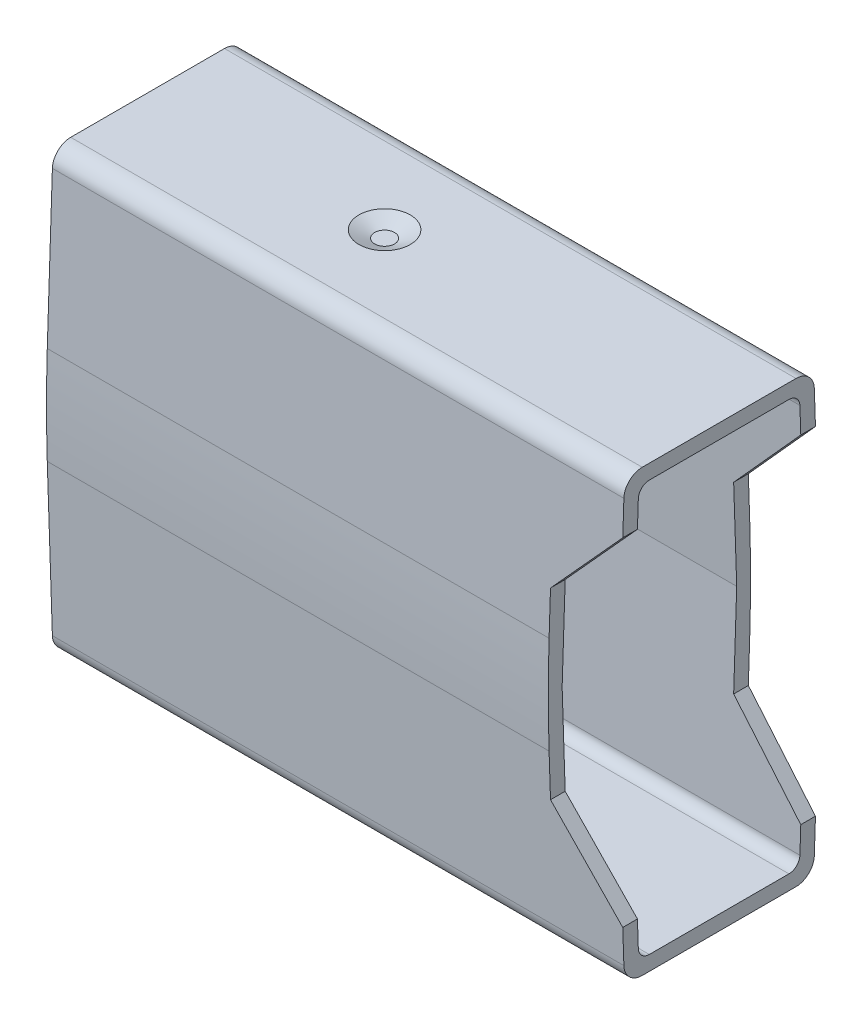
ISO-10303-21;
HEADER;
FILE_DESCRIPTION(('STEP AP214'),'2;1');
FILE_NAME('part.step','',(''),(''),'','','');
FILE_SCHEMA(('AUTOMOTIVE_DESIGN { 1 0 10303 214 1 1 1 1 }'));
ENDSEC;
DATA;
#1=APPLICATION_CONTEXT('core data for automotive mechanical design processes');
#2=APPLICATION_PROTOCOL_DEFINITION('international standard','automotive_design',2000,#1);
#3=PRODUCT_CONTEXT('',#1,'mechanical');
#4=PRODUCT('Part','Part','',(#3));
#5=PRODUCT_RELATED_PRODUCT_CATEGORY('part','',(#4));
#6=PRODUCT_DEFINITION_FORMATION('','',#4);
#7=PRODUCT_DEFINITION_CONTEXT('part definition',#1,'design');
#8=PRODUCT_DEFINITION('design','',#6,#7);
#9=PRODUCT_DEFINITION_SHAPE('','',#8);
#10=(LENGTH_UNIT() NAMED_UNIT(*) SI_UNIT(.MILLI.,.METRE.));
#11=(NAMED_UNIT(*) PLANE_ANGLE_UNIT() SI_UNIT($,.RADIAN.));
#12=(NAMED_UNIT(*) SI_UNIT($,.STERADIAN.) SOLID_ANGLE_UNIT());
#13=UNCERTAINTY_MEASURE_WITH_UNIT(LENGTH_MEASURE(1.E-05),#10,'distance_accuracy_value','');
#14=(GEOMETRIC_REPRESENTATION_CONTEXT(3) GLOBAL_UNCERTAINTY_ASSIGNED_CONTEXT((#13)) GLOBAL_UNIT_ASSIGNED_CONTEXT((#10,
#11,#12)) REPRESENTATION_CONTEXT('',''));
#15=CARTESIAN_POINT('',(0.,0.,0.));
#16=DIRECTION('',(0.,0.,1.));
#17=DIRECTION('',(1.,0.,0.));
#18=AXIS2_PLACEMENT_3D('',#15,#16,#17);
#19=CARTESIAN_POINT('',(80.645,6.985,-6.19303264711368));
#20=DIRECTION('',(1.,0.,0.));
#21=DIRECTION('',(0.,0.,-1.));
#22=AXIS2_PLACEMENT_3D('',#19,#20,#21);
#23=PLANE('',#22);
#24=DIRECTION('',(0.,0.,1.));
#25=VECTOR('',#24,1.);
#26=CARTESIAN_POINT('',(80.645,5.842,-7.03299012029518));
#27=LINE('',#26,#25);
#28=CARTESIAN_POINT('',(80.645,5.842,-6.86648222632835));
#29=VERTEX_POINT('',#28);
#30=CARTESIAN_POINT('',(80.645,5.842,-6.3582001275313));
#31=VERTEX_POINT('',#30);
#32=EDGE_CURVE('E441',#29,#31,#27,.T.);
#33=ORIENTED_EDGE('',*,*,#32,.F.);
#34=DIRECTION('',(0.,0.999444995608313,0.0333121712516466));
#35=VECTOR('',#34,1.);
#36=CARTESIAN_POINT('',(80.645,7.0061532287448,-6.82768021932496));
#37=LINE('',#36,#35);
#38=CARTESIAN_POINT('',(80.645,7.0061532287448,-6.82768021932496));
#39=VERTEX_POINT('',#38);
#40=EDGE_CURVE('E338',#29,#39,#37,.T.);
#41=ORIENTED_EDGE('',*,*,#40,.T.);
#42=CARTESIAN_POINT('',(80.645,6.985,-6.19303264711368));
#43=DIRECTION('',(1.,0.,0.));
#44=DIRECTION('',(0.,0.,-1.));
#45=AXIS2_PLACEMENT_3D('',#42,#43,#44);
#46=CIRCLE('',#45,0.635);
#47=CARTESIAN_POINT('',(80.645,7.62,-6.19303264711368));
#48=VERTEX_POINT('',#47);
#49=EDGE_CURVE('E377',#39,#48,#46,.T.);
#50=ORIENTED_EDGE('',*,*,#49,.T.);
#51=DIRECTION('',(0.,0.,1.));
#52=VECTOR('',#51,1.);
#53=CARTESIAN_POINT('',(80.645,7.62,-6.19303264711368));
#54=LINE('',#53,#52);
#55=CARTESIAN_POINT('',(80.645,7.62,-0.868167352886323));
#56=VERTEX_POINT('',#55);
#57=EDGE_CURVE('E376',#48,#56,#54,.T.);
#58=ORIENTED_EDGE('',*,*,#57,.T.);
#59=CARTESIAN_POINT('',(80.645,6.985,-0.868167352886323));
#60=DIRECTION('',(1.,0.,0.));
#61=DIRECTION('',(0.,0.,-1.));
#62=AXIS2_PLACEMENT_3D('',#59,#60,#61);
#63=CIRCLE('',#62,0.635);
#64=CARTESIAN_POINT('',(80.645,7.0061532287448,-0.233519780675044));
#65=VERTEX_POINT('',#64);
#66=EDGE_CURVE('E327',#56,#65,#63,.T.);
#67=ORIENTED_EDGE('',*,*,#66,.T.);
#68=DIRECTION('',(0.,-0.999444995608313,0.0333121712516467));
#69=VECTOR('',#68,1.);
#70=CARTESIAN_POINT('',(80.645,7.0061532287448,-0.233519780675044));
#71=LINE('',#70,#69);
#72=CARTESIAN_POINT('',(80.645,5.842,-0.194717773671647));
#73=VERTEX_POINT('',#72);
#74=EDGE_CURVE('E323',#65,#73,#71,.T.);
#75=ORIENTED_EDGE('',*,*,#74,.T.);
#76=CARTESIAN_POINT('',(80.645,5.842,-0.702999872468696));
#77=VERTEX_POINT('',#76);
#78=EDGE_CURVE('E448',#77,#73,#27,.T.);
#79=ORIENTED_EDGE('',*,*,#78,.F.);
#80=DIRECTION('',(0.,-0.999444995608313,0.0333121712516467));
#81=VECTOR('',#80,1.);
#82=CARTESIAN_POINT('',(80.645,0.,-0.508282098797048));
#83=LINE('',#82,#81);
#84=CARTESIAN_POINT('',(80.645,6.74369193724688,-0.733053868798443));
#85=VERTEX_POINT('',#84);
#86=EDGE_CURVE('E396',#85,#77,#83,.T.);
#87=ORIENTED_EDGE('',*,*,#86,.F.);
#88=CARTESIAN_POINT('',(80.645,6.731,-1.11384241212521));
#89=DIRECTION('',(1.,0.,0.));
#90=DIRECTION('',(0.,0.,-1.));
#91=AXIS2_PLACEMENT_3D('',#88,#89,#90);
#92=CIRCLE('',#91,0.381);
#93=CARTESIAN_POINT('',(80.645,7.112,-1.11384241212521));
#94=VERTEX_POINT('',#93);
#95=EDGE_CURVE('E399',#94,#85,#92,.T.);
#96=ORIENTED_EDGE('',*,*,#95,.F.);
#97=DIRECTION('',(0.,0.,1.));
#98=VECTOR('',#97,1.);
#99=CARTESIAN_POINT('',(80.645,7.112,-1.11384241212521));
#100=LINE('',#99,#98);
#101=CARTESIAN_POINT('',(80.645,7.112,-5.94735758787479));
#102=VERTEX_POINT('',#101);
#103=EDGE_CURVE('E402',#102,#94,#100,.T.);
#104=ORIENTED_EDGE('',*,*,#103,.F.);
#105=CARTESIAN_POINT('',(80.645,6.731,-5.94735758787479));
#106=DIRECTION('',(1.,0.,0.));
#107=DIRECTION('',(0.,0.,-1.));
#108=AXIS2_PLACEMENT_3D('',#105,#106,#107);
#109=CIRCLE('',#108,0.381);
#110=CARTESIAN_POINT('',(80.645,6.74369193724688,-6.32814613120156));
#111=VERTEX_POINT('',#110);
#112=EDGE_CURVE('E405',#111,#102,#109,.T.);
#113=ORIENTED_EDGE('',*,*,#112,.F.);
#114=DIRECTION('',(0.,0.999444995608313,0.0333121712516466));
#115=VECTOR('',#114,1.);
#116=CARTESIAN_POINT('',(80.645,6.74369193724688,-6.32814613120156));
#117=LINE('',#116,#115);
#118=EDGE_CURVE('E381',#31,#111,#117,.T.);
#119=ORIENTED_EDGE('',*,*,#118,.F.);
#120=EDGE_LOOP('',(#33,#41,#50,#58,#67,#75,#79,#87,#96,#104,#113,#119));
#121=FACE_BOUND('',#120,.T.);
#122=ADVANCED_FACE('F37',(#121),#23,.T.);
#123=CARTESIAN_POINT('',(80.645,0.,-6.55291790120295));
#124=DIRECTION('',(0.,-0.0333121712516467,0.999444995608313));
#125=DIRECTION('',(0.,-0.999444995608313,-0.0333121712516467));
#126=AXIS2_PLACEMENT_3D('',#123,#124,#125);
#127=PLANE('',#126);
#128=DIRECTION('',(0.,0.999444995608313,0.0333121712516467));
#129=VECTOR('',#128,1.);
#130=CARTESIAN_POINT('',(60.8571217387208,0.,-6.55291790120295));
#131=LINE('',#130,#129);
#132=CARTESIAN_POINT('',(60.8571217387208,0.,-6.55291790120295));
#133=VERTEX_POINT('',#132);
#134=CARTESIAN_POINT('',(60.8571217387208,6.74369193724688,-6.32814613120156));
#135=VERTEX_POINT('',#134);
#136=EDGE_CURVE('E469',#133,#135,#131,.T.);
#137=ORIENTED_EDGE('',*,*,#136,.F.);
#138=DIRECTION('',(-1.,0.,0.));
#139=VECTOR('',#138,1.);
#140=CARTESIAN_POINT('',(80.645,0.,-6.55291790120295));
#141=LINE('',#140,#139);
#142=CARTESIAN_POINT('',(78.232,0.,-6.55291790120295));
#143=VERTEX_POINT('',#142);
#144=EDGE_CURVE('E344',#143,#133,#141,.T.);
#145=ORIENTED_EDGE('',*,*,#144,.F.);
#146=DIRECTION('',(0.,-0.999444995608313,-0.0333121712516467));
#147=VECTOR('',#146,1.);
#148=CARTESIAN_POINT('',(78.232,0.,-6.55291790120295));
#149=LINE('',#148,#147);
#150=CARTESIAN_POINT('',(78.232,3.175,-6.44709302420749));
#151=VERTEX_POINT('',#150);
#152=EDGE_CURVE('E420',#151,#143,#149,.T.);
#153=ORIENTED_EDGE('',*,*,#152,.F.);
#154=DIRECTION('',(-0.670708495740711,-0.741309390029208,-0.0247083385875341));
#155=VECTOR('',#154,1.);
#156=CARTESIAN_POINT('',(77.7371160797596,2.62802303552372,-6.4653241328642));
#157=LINE('',#156,#155);
#158=EDGE_CURVE('E414',#31,#151,#157,.T.);
#159=ORIENTED_EDGE('',*,*,#158,.F.);
#160=ORIENTED_EDGE('',*,*,#118,.T.);
#161=DIRECTION('',(-1.,0.,0.));
#162=VECTOR('',#161,1.);
#163=CARTESIAN_POINT('',(0.237047724469863,6.74369193724688,-6.32814613120156));
#164=LINE('',#163,#162);
#165=EDGE_CURVE('E261',#111,#135,#164,.T.);
#166=ORIENTED_EDGE('',*,*,#165,.T.);
#167=EDGE_LOOP('',(#137,#145,#153,#159,#160,#166));
#168=FACE_BOUND('',#167,.T.);
#169=ADVANCED_FACE('F518',(#168),#127,.T.);
#170=CARTESIAN_POINT('',(80.645,7.112,-0.74532982326688));
#171=DIRECTION('',(0.,-0.0333121712516467,-0.999444995608313));
#172=DIRECTION('',(0.,0.999444995608313,-0.0333121712516467));
#173=AXIS2_PLACEMENT_3D('',#170,#171,#172);
#174=PLANE('',#173);
#175=DIRECTION('',(0.,-0.999444995608313,0.0333121712516467));
#176=VECTOR('',#175,1.);
#177=CARTESIAN_POINT('',(60.8571217387208,7.112,-0.74532982326688));
#178=LINE('',#177,#176);
#179=CARTESIAN_POINT('',(60.8571217387208,6.74369193724688,-0.733053868798443));
#180=VERTEX_POINT('',#179);
#181=CARTESIAN_POINT('',(60.8571217387208,0.,-0.508282098797048));
#182=VERTEX_POINT('',#181);
#183=EDGE_CURVE('E52',#180,#182,#178,.T.);
#184=ORIENTED_EDGE('',*,*,#183,.F.);
#185=DIRECTION('',(-1.,0.,0.));
#186=VECTOR('',#185,1.);
#187=CARTESIAN_POINT('',(80.4079522755302,6.74369193724688,-0.733053868798443));
#188=LINE('',#187,#186);
#189=EDGE_CURVE('E273',#180,#85,#188,.F.);
#190=ORIENTED_EDGE('',*,*,#189,.T.);
#191=ORIENTED_EDGE('',*,*,#86,.T.);
#192=DIRECTION('',(0.670708495740711,0.741309390029208,-0.0247083385875341));
#193=VECTOR('',#192,1.);
#194=CARTESIAN_POINT('',(81.2771486783131,6.54069064445136,-0.726287699714977));
#195=LINE('',#194,#193);
#196=CARTESIAN_POINT('',(78.232,3.175,-0.614106975792508));
#197=VERTEX_POINT('',#196);
#198=EDGE_CURVE('E416',#197,#77,#195,.T.);
#199=ORIENTED_EDGE('',*,*,#198,.F.);
#200=DIRECTION('',(0.,0.999444995608313,-0.0333121712516467));
#201=VECTOR('',#200,1.);
#202=CARTESIAN_POINT('',(78.232,7.112,-0.74532982326688));
#203=LINE('',#202,#201);
#204=CARTESIAN_POINT('',(78.232,0.,-0.508282098797048));
#205=VERTEX_POINT('',#204);
#206=EDGE_CURVE('E424',#205,#197,#203,.T.);
#207=ORIENTED_EDGE('',*,*,#206,.F.);
#208=DIRECTION('',(-1.,0.,0.));
#209=VECTOR('',#208,1.);
#210=CARTESIAN_POINT('',(80.645,0.,-0.508282098797048));
#211=LINE('',#210,#209);
#212=EDGE_CURVE('E341',#205,#182,#211,.T.);
#213=ORIENTED_EDGE('',*,*,#212,.T.);
#214=EDGE_LOOP('',(#184,#190,#191,#199,#207,#213));
#215=FACE_BOUND('',#214,.T.);
#216=ADVANCED_FACE('F556',(#215),#174,.T.);
#217=CARTESIAN_POINT('',(80.645,6.731,-1.11384241212521));
#218=DIRECTION('',(1.,0.,0.));
#219=DIRECTION('',(0.,0.,-1.));
#220=AXIS2_PLACEMENT_3D('',#217,#218,#219);
#221=CYLINDRICAL_SURFACE('',#220,0.381);
#222=ORIENTED_EDGE('',*,*,#189,.F.);
#223=CARTESIAN_POINT('',(60.8571217387208,6.731,-1.11384241212521));
#224=DIRECTION('',(1.,0.,0.));
#225=DIRECTION('',(0.,0.,-1.));
#226=AXIS2_PLACEMENT_3D('',#223,#224,#225);
#227=CIRCLE('',#226,0.381);
#228=CARTESIAN_POINT('',(60.8571217387208,7.112,-1.11384241212521));
#229=VERTEX_POINT('',#228);
#230=EDGE_CURVE('E461',#180,#229,#227,.F.);
#231=ORIENTED_EDGE('',*,*,#230,.T.);
#232=DIRECTION('',(-1.,0.,0.));
#233=VECTOR('',#232,1.);
#234=CARTESIAN_POINT('',(0.237047724469849,7.112,-1.11384241212521));
#235=LINE('',#234,#233);
#236=EDGE_CURVE('E268',#94,#229,#235,.T.);
#237=ORIENTED_EDGE('',*,*,#236,.F.);
#238=ORIENTED_EDGE('',*,*,#95,.T.);
#239=EDGE_LOOP('',(#222,#231,#237,#238));
#240=FACE_BOUND('',#239,.T.);
#241=ADVANCED_FACE('F579',(#240),#221,.F.);
#242=CARTESIAN_POINT('',(80.645,7.112,-6.31587017673312));
#243=DIRECTION('',(0.,-1.,0.));
#244=DIRECTION('',(0.,0.,-1.));
#245=AXIS2_PLACEMENT_3D('',#242,#243,#244);
#246=PLANE('',#245);
#247=DIRECTION('',(0.,0.,1.));
#248=VECTOR('',#247,1.);
#249=CARTESIAN_POINT('',(60.8571217387208,7.112,-6.31587017673312));
#250=LINE('',#249,#248);
#251=CARTESIAN_POINT('',(60.8571217387208,7.112,-5.94735758787479));
#252=VERTEX_POINT('',#251);
#253=EDGE_CURVE('E464',#252,#229,#250,.T.);
#254=ORIENTED_EDGE('',*,*,#253,.F.);
#255=DIRECTION('',(-1.,0.,0.));
#256=VECTOR('',#255,1.);
#257=CARTESIAN_POINT('',(80.4079522755302,7.112,-5.94735758787479));
#258=LINE('',#257,#256);
#259=EDGE_CURVE('E271',#252,#102,#258,.F.);
#260=ORIENTED_EDGE('',*,*,#259,.T.);
#261=ORIENTED_EDGE('',*,*,#103,.T.);
#262=ORIENTED_EDGE('',*,*,#236,.T.);
#263=EDGE_LOOP('',(#254,#260,#261,#262));
#264=FACE_BOUND('',#263,.T.);
#265=ADVANCED_FACE('F581',(#264),#246,.T.);
#266=CARTESIAN_POINT('',(80.645,6.731,-5.94735758787479));
#267=DIRECTION('',(1.,0.,0.));
#268=DIRECTION('',(0.,0.,-1.));
#269=AXIS2_PLACEMENT_3D('',#266,#267,#268);
#270=CYLINDRICAL_SURFACE('',#269,0.381);
#271=ORIENTED_EDGE('',*,*,#259,.F.);
#272=CARTESIAN_POINT('',(60.8571217387208,6.731,-5.94735758787479));
#273=DIRECTION('',(1.,0.,0.));
#274=DIRECTION('',(0.,0.,-1.));
#275=AXIS2_PLACEMENT_3D('',#272,#273,#274);
#276=CIRCLE('',#275,0.381);
#277=EDGE_CURVE('E466',#252,#135,#276,.F.);
#278=ORIENTED_EDGE('',*,*,#277,.T.);
#279=ORIENTED_EDGE('',*,*,#165,.F.);
#280=ORIENTED_EDGE('',*,*,#112,.T.);
#281=EDGE_LOOP('',(#271,#278,#279,#280));
#282=FACE_BOUND('',#281,.T.);
#283=ADVANCED_FACE('F583',(#282),#270,.F.);
#284=CARTESIAN_POINT('',(80.645,-7.112,-6.31587017673312));
#285=DIRECTION('',(0.,0.0333121712516467,0.999444995608313));
#286=DIRECTION('',(0.,-0.999444995608313,0.0333121712516467));
#287=AXIS2_PLACEMENT_3D('',#284,#285,#286);
#288=PLANE('',#287);
#289=DIRECTION('',(0.,0.999444995608313,-0.0333121712516467));
#290=VECTOR('',#289,1.);
#291=CARTESIAN_POINT('',(60.8571217387208,-7.112,-6.31587017673312));
#292=LINE('',#291,#290);
#293=CARTESIAN_POINT('',(60.8571217387208,-6.74369193724688,-6.32814613120156));
#294=VERTEX_POINT('',#293);
#295=EDGE_CURVE('E472',#294,#133,#292,.T.);
#296=ORIENTED_EDGE('',*,*,#295,.F.);
#297=DIRECTION('',(-1.,0.,0.));
#298=VECTOR('',#297,1.);
#299=CARTESIAN_POINT('',(80.4079522755302,-6.74369193724688,-6.32814613120156));
#300=LINE('',#299,#298);
#301=CARTESIAN_POINT('',(80.645,-6.74369193724688,-6.32814613120156));
#302=VERTEX_POINT('',#301);
#303=EDGE_CURVE('E283',#294,#302,#300,.F.);
#304=ORIENTED_EDGE('',*,*,#303,.T.);
#305=DIRECTION('',(0.,0.999444995608313,-0.0333121712516466));
#306=VECTOR('',#305,1.);
#307=CARTESIAN_POINT('',(80.645,-6.74369193724688,-6.32814613120156));
#308=LINE('',#307,#306);
#309=CARTESIAN_POINT('',(80.645,-5.842,-6.3582001275313));
#310=VERTEX_POINT('',#309);
#311=EDGE_CURVE('E383',#302,#310,#308,.T.);
#312=ORIENTED_EDGE('',*,*,#311,.T.);
#313=DIRECTION('',(0.670708495740711,-0.741309390029207,0.0247083385875341));
#314=VECTOR('',#313,1.);
#315=CARTESIAN_POINT('',(81.2771486783131,-6.54069064445136,-6.33491230028502));
#316=LINE('',#315,#314);
#317=CARTESIAN_POINT('',(78.232,-3.175,-6.44709302420749));
#318=VERTEX_POINT('',#317);
#319=EDGE_CURVE('E408',#318,#310,#316,.T.);
#320=ORIENTED_EDGE('',*,*,#319,.F.);
#321=DIRECTION('',(0.,-0.999444995608313,0.0333121712516467));
#322=VECTOR('',#321,1.);
#323=CARTESIAN_POINT('',(78.232,-7.112,-6.31587017673312));
#324=LINE('',#323,#322);
#325=EDGE_CURVE('E422',#143,#318,#324,.T.);
#326=ORIENTED_EDGE('',*,*,#325,.F.);
#327=ORIENTED_EDGE('',*,*,#144,.T.);
#328=EDGE_LOOP('',(#296,#304,#312,#320,#326,#327));
#329=FACE_BOUND('',#328,.T.);
#330=ADVANCED_FACE('F521',(#329),#288,.T.);
#331=CARTESIAN_POINT('',(80.645,-6.731,-5.94735758787479));
#332=DIRECTION('',(1.,0.,0.));
#333=DIRECTION('',(0.,0.,-1.));
#334=AXIS2_PLACEMENT_3D('',#331,#332,#333);
#335=CYLINDRICAL_SURFACE('',#334,0.381);
#336=ORIENTED_EDGE('',*,*,#303,.F.);
#337=CARTESIAN_POINT('',(60.8571217387208,-6.731,-5.94735758787479));
#338=DIRECTION('',(1.,0.,0.));
#339=DIRECTION('',(0.,0.,-1.));
#340=AXIS2_PLACEMENT_3D('',#337,#338,#339);
#341=CIRCLE('',#340,0.381);
#342=CARTESIAN_POINT('',(60.8571217387208,-7.112,-5.94735758787479));
#343=VERTEX_POINT('',#342);
#344=EDGE_CURVE('E474',#294,#343,#341,.F.);
#345=ORIENTED_EDGE('',*,*,#344,.T.);
#346=DIRECTION('',(-1.,0.,0.));
#347=VECTOR('',#346,1.);
#348=CARTESIAN_POINT('',(0.237047724469863,-7.112,-5.94735758787479));
#349=LINE('',#348,#347);
#350=CARTESIAN_POINT('',(80.645,-7.112,-5.94735758787479));
#351=VERTEX_POINT('',#350);
#352=EDGE_CURVE('E278',#351,#343,#349,.T.);
#353=ORIENTED_EDGE('',*,*,#352,.F.);
#354=CARTESIAN_POINT('',(80.645,-6.731,-5.94735758787479));
#355=DIRECTION('',(1.,0.,0.));
#356=DIRECTION('',(0.,0.,-1.));
#357=AXIS2_PLACEMENT_3D('',#354,#355,#356);
#358=CIRCLE('',#357,0.381000000000001);
#359=EDGE_CURVE('E386',#351,#302,#358,.T.);
#360=ORIENTED_EDGE('',*,*,#359,.T.);
#361=EDGE_LOOP('',(#336,#345,#353,#360));
#362=FACE_BOUND('',#361,.T.);
#363=ADVANCED_FACE('F588',(#362),#335,.F.);
#364=CARTESIAN_POINT('',(80.645,-7.112,-0.74532982326688));
#365=DIRECTION('',(0.,1.,0.));
#366=DIRECTION('',(0.,0.,1.));
#367=AXIS2_PLACEMENT_3D('',#364,#365,#366);
#368=PLANE('',#367);
#369=DIRECTION('',(0.,0.,-1.));
#370=VECTOR('',#369,1.);
#371=CARTESIAN_POINT('',(60.8571217387208,-7.112,-0.74532982326688));
#372=LINE('',#371,#370);
#373=CARTESIAN_POINT('',(60.8571217387208,-7.112,-1.11384241212521));
#374=VERTEX_POINT('',#373);
#375=EDGE_CURVE('E477',#374,#343,#372,.T.);
#376=ORIENTED_EDGE('',*,*,#375,.F.);
#377=DIRECTION('',(-1.,0.,0.));
#378=VECTOR('',#377,1.);
#379=CARTESIAN_POINT('',(80.4079522755302,-7.112,-1.11384241212521));
#380=LINE('',#379,#378);
#381=CARTESIAN_POINT('',(80.645,-7.112,-1.11384241212521));
#382=VERTEX_POINT('',#381);
#383=EDGE_CURVE('E281',#374,#382,#380,.F.);
#384=ORIENTED_EDGE('',*,*,#383,.T.);
#385=DIRECTION('',(0.,0.,-1.));
#386=VECTOR('',#385,1.);
#387=CARTESIAN_POINT('',(80.645,-7.112,-1.11384241212521));
#388=LINE('',#387,#386);
#389=EDGE_CURVE('E389',#382,#351,#388,.T.);
#390=ORIENTED_EDGE('',*,*,#389,.T.);
#391=ORIENTED_EDGE('',*,*,#352,.T.);
#392=EDGE_LOOP('',(#376,#384,#390,#391));
#393=FACE_BOUND('',#392,.T.);
#394=ADVANCED_FACE('F573',(#393),#368,.T.);
#395=CARTESIAN_POINT('',(80.645,-6.731,-1.11384241212521));
#396=DIRECTION('',(1.,0.,0.));
#397=DIRECTION('',(0.,0.,-1.));
#398=AXIS2_PLACEMENT_3D('',#395,#396,#397);
#399=CYLINDRICAL_SURFACE('',#398,0.381);
#400=ORIENTED_EDGE('',*,*,#383,.F.);
#401=CARTESIAN_POINT('',(60.8571217387208,-6.731,-1.11384241212521));
#402=DIRECTION('',(1.,0.,0.));
#403=DIRECTION('',(0.,0.,-1.));
#404=AXIS2_PLACEMENT_3D('',#401,#402,#403);
#405=CIRCLE('',#404,0.381);
#406=CARTESIAN_POINT('',(60.8571217387208,-6.74369193724687,-0.733053868798443));
#407=VERTEX_POINT('',#406);
#408=EDGE_CURVE('E479',#374,#407,#405,.F.);
#409=ORIENTED_EDGE('',*,*,#408,.T.);
#410=DIRECTION('',(-1.,0.,0.));
#411=VECTOR('',#410,1.);
#412=CARTESIAN_POINT('',(0.237047724469863,-6.74369193724688,-0.733053868798443));
#413=LINE('',#412,#411);
#414=CARTESIAN_POINT('',(80.645,-6.74369193724688,-0.733053868798443));
#415=VERTEX_POINT('',#414);
#416=EDGE_CURVE('E275',#415,#407,#413,.T.);
#417=ORIENTED_EDGE('',*,*,#416,.F.);
#418=CARTESIAN_POINT('',(80.645,-6.731,-1.11384241212521));
#419=DIRECTION('',(1.,0.,0.));
#420=DIRECTION('',(0.,0.,-1.));
#421=AXIS2_PLACEMENT_3D('',#418,#419,#420);
#422=CIRCLE('',#421,0.381);
#423=EDGE_CURVE('E392',#415,#382,#422,.T.);
#424=ORIENTED_EDGE('',*,*,#423,.T.);
#425=EDGE_LOOP('',(#400,#409,#417,#424));
#426=FACE_BOUND('',#425,.T.);
#427=ADVANCED_FACE('F567',(#426),#399,.F.);
#428=CARTESIAN_POINT('',(80.645,0.,-0.508282098797048));
#429=DIRECTION('',(0.,0.0333121712516467,-0.999444995608313));
#430=DIRECTION('',(0.,0.999444995608313,0.0333121712516467));
#431=AXIS2_PLACEMENT_3D('',#428,#429,#430);
#432=PLANE('',#431);
#433=DIRECTION('',(0.,-0.999444995608313,-0.0333121712516467));
#434=VECTOR('',#433,1.);
#435=CARTESIAN_POINT('',(60.8571217387208,0.,-0.508282098797048));
#436=LINE('',#435,#434);
#437=EDGE_CURVE('E249',#182,#407,#436,.T.);
#438=ORIENTED_EDGE('',*,*,#437,.F.);
#439=ORIENTED_EDGE('',*,*,#212,.F.);
#440=DIRECTION('',(0.,0.999444995608313,0.0333121712516467));
#441=VECTOR('',#440,1.);
#442=CARTESIAN_POINT('',(78.232,0.,-0.508282098797048));
#443=LINE('',#442,#441);
#444=CARTESIAN_POINT('',(78.232,-3.175,-0.614106975792508));
#445=VERTEX_POINT('',#444);
#446=EDGE_CURVE('E426',#445,#205,#443,.T.);
#447=ORIENTED_EDGE('',*,*,#446,.F.);
#448=DIRECTION('',(-0.670708495740711,0.741309390029207,0.0247083385875341));
#449=VECTOR('',#448,1.);
#450=CARTESIAN_POINT('',(77.7371160797596,-2.62802303552372,-0.595875867135799));
#451=LINE('',#450,#449);
#452=CARTESIAN_POINT('',(80.645,-5.842,-0.702999872468696));
#453=VERTEX_POINT('',#452);
#454=EDGE_CURVE('E410',#453,#445,#451,.T.);
#455=ORIENTED_EDGE('',*,*,#454,.F.);
#456=DIRECTION('',(0.,-0.999444995608313,-0.0333121712516467));
#457=VECTOR('',#456,1.);
#458=CARTESIAN_POINT('',(80.645,0.,-0.508282098797048));
#459=LINE('',#458,#457);
#460=EDGE_CURVE('E317',#453,#415,#459,.T.);
#461=ORIENTED_EDGE('',*,*,#460,.T.);
#462=ORIENTED_EDGE('',*,*,#416,.T.);
#463=EDGE_LOOP('',(#438,#439,#447,#455,#461,#462));
#464=FACE_BOUND('',#463,.T.);
#465=ADVANCED_FACE('F561',(#464),#432,.T.);
#466=DIRECTION('',(0.,0.,1.));
#467=VECTOR('',#466,1.);
#468=CARTESIAN_POINT('',(80.645,-5.842,-7.03299012029518));
#469=LINE('',#468,#467);
#470=CARTESIAN_POINT('',(80.645,-5.842,-0.194717773671648));
#471=VERTEX_POINT('',#470);
#472=EDGE_CURVE('E304',#453,#471,#469,.T.);
#473=ORIENTED_EDGE('',*,*,#472,.T.);
#474=DIRECTION('',(0.,-0.999444995608313,-0.0333121712516467));
#475=VECTOR('',#474,1.);
#476=CARTESIAN_POINT('',(80.645,-7.0061532287448,-0.233519780675044));
#477=LINE('',#476,#475);
#478=CARTESIAN_POINT('',(80.645,-7.0061532287448,-0.233519780675044));
#479=VERTEX_POINT('',#478);
#480=EDGE_CURVE('E315',#471,#479,#477,.T.);
#481=ORIENTED_EDGE('',*,*,#480,.T.);
#482=CARTESIAN_POINT('',(80.645,-6.985,-0.868167352886323));
#483=DIRECTION('',(1.,0.,0.));
#484=DIRECTION('',(0.,0.,-1.));
#485=AXIS2_PLACEMENT_3D('',#482,#483,#484);
#486=CIRCLE('',#485,0.635);
#487=CARTESIAN_POINT('',(80.645,-7.62,-0.868167352886323));
#488=VERTEX_POINT('',#487);
#489=EDGE_CURVE('E322',#479,#488,#486,.T.);
#490=ORIENTED_EDGE('',*,*,#489,.T.);
#491=DIRECTION('',(0.,0.,-1.));
#492=VECTOR('',#491,1.);
#493=CARTESIAN_POINT('',(80.645,-7.62,-6.19303264711368));
#494=LINE('',#493,#492);
#495=CARTESIAN_POINT('',(80.645,-7.62,-6.19303264711368));
#496=VERTEX_POINT('',#495);
#497=EDGE_CURVE('E256',#488,#496,#494,.T.);
#498=ORIENTED_EDGE('',*,*,#497,.T.);
#499=CARTESIAN_POINT('',(80.645,-6.985,-6.19303264711368));
#500=DIRECTION('',(1.,0.,0.));
#501=DIRECTION('',(0.,0.,-1.));
#502=AXIS2_PLACEMENT_3D('',#499,#500,#501);
#503=CIRCLE('',#502,0.635);
#504=CARTESIAN_POINT('',(80.645,-7.0061532287448,-6.82768021932496));
#505=VERTEX_POINT('',#504);
#506=EDGE_CURVE('E332',#496,#505,#503,.T.);
#507=ORIENTED_EDGE('',*,*,#506,.T.);
#508=DIRECTION('',(0.,0.999444995608313,-0.0333121712516466));
#509=VECTOR('',#508,1.);
#510=CARTESIAN_POINT('',(80.645,-7.0061532287448,-6.82768021932496));
#511=LINE('',#510,#509);
#512=CARTESIAN_POINT('',(80.645,-5.842,-6.86648222632835));
#513=VERTEX_POINT('',#512);
#514=EDGE_CURVE('E335',#505,#513,#511,.T.);
#515=ORIENTED_EDGE('',*,*,#514,.T.);
#516=EDGE_CURVE('E318',#513,#310,#469,.T.);
#517=ORIENTED_EDGE('',*,*,#516,.T.);
#518=ORIENTED_EDGE('',*,*,#311,.F.);
#519=ORIENTED_EDGE('',*,*,#359,.F.);
#520=ORIENTED_EDGE('',*,*,#389,.F.);
#521=ORIENTED_EDGE('',*,*,#423,.F.);
#522=ORIENTED_EDGE('',*,*,#460,.F.);
#523=EDGE_LOOP('',(#473,#481,#490,#498,#507,#515,#517,#518,#519,#520,#521,#522));
#524=FACE_BOUND('',#523,.T.);
#525=ADVANCED_FACE('F314',(#524),#23,.T.);
#526=CARTESIAN_POINT('',(0.,0.,-7.0612));
#527=DIRECTION('',(0.,-0.0333121712516467,-0.999444995608313));
#528=DIRECTION('',(0.,0.999444995608313,-0.0333121712516467));
#529=AXIS2_PLACEMENT_3D('',#526,#527,#528);
#530=PLANE('',#529);
#531=DIRECTION('',(0.,-0.999444995608313,0.0333121712516467));
#532=VECTOR('',#531,1.);
#533=CARTESIAN_POINT('',(60.8571217387208,0.,-7.0612));
#534=LINE('',#533,#532);
#535=CARTESIAN_POINT('',(60.8571217387208,-1.69225829958366,-7.00479589719749));
#536=VERTEX_POINT('',#535);
#537=CARTESIAN_POINT('',(60.8571217387208,-7.00615322874479,-6.82768021932496));
#538=VERTEX_POINT('',#537);
#539=EDGE_CURVE('E494',#536,#538,#534,.T.);
#540=ORIENTED_EDGE('',*,*,#539,.F.);
#541=DIRECTION('',(1.,0.,0.));
#542=VECTOR('',#541,1.);
#543=CARTESIAN_POINT('',(80.645,-1.69225829958365,-7.00479589719748));
#544=LINE('',#543,#542);
#545=CARTESIAN_POINT('',(78.232,-1.69225829958366,-7.0047958971975));
#546=VERTEX_POINT('',#545);
#547=EDGE_CURVE('E293',#536,#546,#544,.T.);
#548=ORIENTED_EDGE('',*,*,#547,.T.);
#549=DIRECTION('',(0.,0.999444995608313,-0.0333121712516467));
#550=VECTOR('',#549,1.);
#551=CARTESIAN_POINT('',(78.232,0.,-7.0612));
#552=LINE('',#551,#550);
#553=CARTESIAN_POINT('',(78.232,-3.175,-6.95537512300454));
#554=VERTEX_POINT('',#553);
#555=EDGE_CURVE('E435',#554,#546,#552,.T.);
#556=ORIENTED_EDGE('',*,*,#555,.F.);
#557=DIRECTION('',(-0.670708495740712,0.741309390029207,-0.0247083385875341));
#558=VECTOR('',#557,1.);
#559=CARTESIAN_POINT('',(41.4589720024212,37.4688730499555,-8.31006263989608));
#560=LINE('',#559,#558);
#561=EDGE_CURVE('E412',#513,#554,#560,.T.);
#562=ORIENTED_EDGE('',*,*,#561,.F.);
#563=ORIENTED_EDGE('',*,*,#514,.F.);
#564=DIRECTION('',(-1.,0.,0.));
#565=VECTOR('',#564,1.);
#566=CARTESIAN_POINT('',(0.,-7.00615322874479,-6.82768021932496));
#567=LINE('',#566,#565);
#568=EDGE_CURVE('E257',#505,#538,#567,.T.);
#569=ORIENTED_EDGE('',*,*,#568,.T.);
#570=EDGE_LOOP('',(#540,#548,#556,#562,#563,#569));
#571=FACE_BOUND('',#570,.T.);
#572=ADVANCED_FACE('F534',(#571),#530,.T.);
#573=CARTESIAN_POINT('',(0.,0.,0.));
#574=DIRECTION('',(0.,-0.0333121712516467,0.999444995608313));
#575=DIRECTION('',(0.,-0.999444995608313,-0.0333121712516467));
#576=AXIS2_PLACEMENT_3D('',#573,#574,#575);
#577=PLANE('',#576);
#578=DIRECTION('',(0.,0.999444995608313,0.0333121712516467));
#579=VECTOR('',#578,1.);
#580=CARTESIAN_POINT('',(60.8571217387208,0.,0.));
#581=LINE('',#580,#579);
#582=CARTESIAN_POINT('',(60.8571217387208,-7.00615322874479,-0.233519780675045));
#583=VERTEX_POINT('',#582);
#584=CARTESIAN_POINT('',(60.8571217387208,-1.69225829958365,-0.0564041028025125));
#585=VERTEX_POINT('',#584);
#586=EDGE_CURVE('E250',#583,#585,#581,.T.);
#587=ORIENTED_EDGE('',*,*,#586,.F.);
#588=DIRECTION('',(1.,0.,0.));
#589=VECTOR('',#588,1.);
#590=CARTESIAN_POINT('',(0.,-7.00615322874479,-0.233519780675044));
#591=LINE('',#590,#589);
#592=EDGE_CURVE('E248',#583,#479,#591,.T.);
#593=ORIENTED_EDGE('',*,*,#592,.T.);
#594=ORIENTED_EDGE('',*,*,#480,.F.);
#595=DIRECTION('',(0.670708495740712,-0.741309390029207,-0.0247083385875341));
#596=VECTOR('',#595,1.);
#597=CARTESIAN_POINT('',(41.4589720024212,37.4688730499555,1.24886263989608));
#598=LINE('',#597,#596);
#599=CARTESIAN_POINT('',(78.232,-3.175,-0.105824876995461));
#600=VERTEX_POINT('',#599);
#601=EDGE_CURVE('E45',#600,#471,#598,.T.);
#602=ORIENTED_EDGE('',*,*,#601,.F.);
#603=DIRECTION('',(0.,-0.999444995608313,-0.0333121712516467));
#604=VECTOR('',#603,1.);
#605=CARTESIAN_POINT('',(78.232,0.,0.));
#606=LINE('',#605,#604);
#607=CARTESIAN_POINT('',(78.232,-1.69225829958365,-0.0564041028025125));
#608=VERTEX_POINT('',#607);
#609=EDGE_CURVE('E428',#608,#600,#606,.T.);
#610=ORIENTED_EDGE('',*,*,#609,.F.);
#611=DIRECTION('',(-1.,0.,0.));
#612=VECTOR('',#611,1.);
#613=CARTESIAN_POINT('',(0.,-1.69225829958365,-0.0564041028025156));
#614=LINE('',#613,#612);
#615=EDGE_CURVE('E287',#608,#585,#614,.T.);
#616=ORIENTED_EDGE('',*,*,#615,.T.);
#617=EDGE_LOOP('',(#587,#593,#594,#602,#610,#616));
#618=FACE_BOUND('',#617,.T.);
#619=ADVANCED_FACE('F321',(#618),#577,.T.);
#620=CARTESIAN_POINT('',(0.,-7.62,0.));
#621=DIRECTION('',(0.,-1.,0.));
#622=DIRECTION('',(0.,0.,-1.));
#623=AXIS2_PLACEMENT_3D('',#620,#621,#622);
#624=PLANE('',#623);
#625=DIRECTION('',(0.,0.,-1.));
#626=VECTOR('',#625,1.);
#627=CARTESIAN_POINT('',(60.8571217387208,-7.62,-13.9338286565192));
#628=LINE('',#627,#626);
#629=CARTESIAN_POINT('',(60.8571217387208,-7.62,-0.868167352886324));
#630=VERTEX_POINT('',#629);
#631=CARTESIAN_POINT('',(60.8571217387208,-7.62,-6.19303264711368));
#632=VERTEX_POINT('',#631);
#633=EDGE_CURVE('E231',#630,#632,#628,.T.);
#634=ORIENTED_EDGE('',*,*,#633,.T.);
#635=DIRECTION('',(-1.,0.,0.));
#636=VECTOR('',#635,1.);
#637=CARTESIAN_POINT('',(0.,-7.62,-6.19303264711368));
#638=LINE('',#637,#636);
#639=EDGE_CURVE('E258',#632,#496,#638,.F.);
#640=ORIENTED_EDGE('',*,*,#639,.T.);
#641=ORIENTED_EDGE('',*,*,#497,.F.);
#642=DIRECTION('',(1.,0.,0.));
#643=VECTOR('',#642,1.);
#644=CARTESIAN_POINT('',(0.,-7.62,-0.868167352886323));
#645=LINE('',#644,#643);
#646=EDGE_CURVE('E246',#488,#630,#645,.F.);
#647=ORIENTED_EDGE('',*,*,#646,.T.);
#648=EDGE_LOOP('',(#634,#640,#641,#647));
#649=FACE_BOUND('',#648,.T.);
#650=CARTESIAN_POINT('',(69.0626,-7.62,-3.5306));
#651=DIRECTION('',(0.,-1.,0.));
#652=DIRECTION('',(0.,0.,-1.));
#653=AXIS2_PLACEMENT_3D('',#650,#651,#652);
#654=CIRCLE('',#653,0.889000000000003);
#655=CARTESIAN_POINT('',(69.0626,-7.62,-4.4196));
#656=VERTEX_POINT('',#655);
#657=EDGE_CURVE('E452',#656,#656,#654,.T.);
#658=ORIENTED_EDGE('',*,*,#657,.F.);
#659=EDGE_LOOP('',(#658));
#660=FACE_BOUND('',#659,.T.);
#661=ADVANCED_FACE('F253',(#649,#660),#624,.T.);
#662=CARTESIAN_POINT('',(0.,0.,0.));
#663=DIRECTION('',(0.,0.0333121712516467,0.999444995608313));
#664=DIRECTION('',(0.,-0.999444995608313,0.0333121712516467));
#665=AXIS2_PLACEMENT_3D('',#662,#663,#664);
#666=PLANE('',#665);
#667=DIRECTION('',(1.,0.,0.));
#668=VECTOR('',#667,1.);
#669=CARTESIAN_POINT('',(0.,7.00615322874479,-0.233519780675044));
#670=LINE('',#669,#668);
#671=CARTESIAN_POINT('',(60.8571217387208,7.0061532287448,-0.233519780675045));
#672=VERTEX_POINT('',#671);
#673=EDGE_CURVE('E354',#65,#672,#670,.F.);
#674=ORIENTED_EDGE('',*,*,#673,.T.);
#675=DIRECTION('',(0.,0.999444995608313,-0.0333121712516467));
#676=VECTOR('',#675,1.);
#677=CARTESIAN_POINT('',(60.8571217387208,0.,0.));
#678=LINE('',#677,#676);
#679=CARTESIAN_POINT('',(60.8571217387208,1.69225829958365,-0.0564041028025156));
#680=VERTEX_POINT('',#679);
#681=EDGE_CURVE('E360',#672,#680,#678,.F.);
#682=ORIENTED_EDGE('',*,*,#681,.T.);
#683=DIRECTION('',(1.,0.,0.));
#684=VECTOR('',#683,1.);
#685=CARTESIAN_POINT('',(80.645,1.69225829958365,-0.0564041028025156));
#686=LINE('',#685,#684);
#687=CARTESIAN_POINT('',(78.232,1.69225829958365,-0.0564041028025156));
#688=VERTEX_POINT('',#687);
#689=EDGE_CURVE('E285',#680,#688,#686,.T.);
#690=ORIENTED_EDGE('',*,*,#689,.T.);
#691=DIRECTION('',(0.,-0.999444995608313,0.0333121712516467));
#692=VECTOR('',#691,1.);
#693=CARTESIAN_POINT('',(78.232,0.,0.));
#694=LINE('',#693,#692);
#695=CARTESIAN_POINT('',(78.232,3.175,-0.105824876995461));
#696=VERTEX_POINT('',#695);
#697=EDGE_CURVE('E430',#688,#696,#694,.F.);
#698=ORIENTED_EDGE('',*,*,#697,.T.);
#699=DIRECTION('',(-0.670708495740711,-0.741309390029207,0.0247083385875341));
#700=VECTOR('',#699,1.);
#701=CARTESIAN_POINT('',(41.4589720024212,-37.4688730499555,1.24886263989608));
#702=LINE('',#701,#700);
#703=EDGE_CURVE('E418',#696,#73,#702,.F.);
#704=ORIENTED_EDGE('',*,*,#703,.T.);
#705=ORIENTED_EDGE('',*,*,#74,.F.);
#706=EDGE_LOOP('',(#674,#682,#690,#698,#704,#705));
#707=FACE_BOUND('',#706,.T.);
#708=ADVANCED_FACE('F359',(#707),#666,.T.);
#709=CARTESIAN_POINT('',(0.,0.,-7.0612));
#710=DIRECTION('',(0.,0.0333121712516467,-0.999444995608313));
#711=DIRECTION('',(0.,0.999444995608313,0.0333121712516467));
#712=AXIS2_PLACEMENT_3D('',#709,#710,#711);
#713=PLANE('',#712);
#714=DIRECTION('',(-1.,0.,0.));
#715=VECTOR('',#714,1.);
#716=CARTESIAN_POINT('',(0.,1.69225829958365,-7.00479589719748));
#717=LINE('',#716,#715);
#718=CARTESIAN_POINT('',(78.232,1.69225829958365,-7.0047958971975));
#719=VERTEX_POINT('',#718);
#720=CARTESIAN_POINT('',(60.8571217387208,1.69225829958365,-7.00479589719748));
#721=VERTEX_POINT('',#720);
#722=EDGE_CURVE('E290',#719,#721,#717,.T.);
#723=ORIENTED_EDGE('',*,*,#722,.T.);
#724=DIRECTION('',(0.,-0.999444995608313,-0.0333121712516467));
#725=VECTOR('',#724,1.);
#726=CARTESIAN_POINT('',(60.8571217387208,0.,-7.0612));
#727=LINE('',#726,#725);
#728=CARTESIAN_POINT('',(60.8571217387208,7.0061532287448,-6.82768021932496));
#729=VERTEX_POINT('',#728);
#730=EDGE_CURVE('E59',#721,#729,#727,.F.);
#731=ORIENTED_EDGE('',*,*,#730,.T.);
#732=DIRECTION('',(-1.,0.,0.));
#733=VECTOR('',#732,1.);
#734=CARTESIAN_POINT('',(0.,7.00615322874479,-6.82768021932496));
#735=LINE('',#734,#733);
#736=EDGE_CURVE('E352',#729,#39,#735,.F.);
#737=ORIENTED_EDGE('',*,*,#736,.T.);
#738=ORIENTED_EDGE('',*,*,#40,.F.);
#739=DIRECTION('',(0.670708495740711,0.741309390029207,0.0247083385875341));
#740=VECTOR('',#739,1.);
#741=CARTESIAN_POINT('',(41.4589720024212,-37.4688730499555,-8.31006263989608));
#742=LINE('',#741,#740);
#743=CARTESIAN_POINT('',(78.232,3.175,-6.95537512300454));
#744=VERTEX_POINT('',#743);
#745=EDGE_CURVE('E297',#29,#744,#742,.F.);
#746=ORIENTED_EDGE('',*,*,#745,.T.);
#747=DIRECTION('',(0.,0.999444995608313,0.0333121712516467));
#748=VECTOR('',#747,1.);
#749=CARTESIAN_POINT('',(78.232,0.,-7.0612));
#750=LINE('',#749,#748);
#751=EDGE_CURVE('E438',#744,#719,#750,.F.);
#752=ORIENTED_EDGE('',*,*,#751,.T.);
#753=EDGE_LOOP('',(#723,#731,#737,#738,#746,#752));
#754=FACE_BOUND('',#753,.T.);
#755=ADVANCED_FACE('F498',(#754),#713,.T.);
#756=CARTESIAN_POINT('',(0.,7.62,0.));
#757=DIRECTION('',(0.,-1.,0.));
#758=DIRECTION('',(0.,0.,-1.));
#759=AXIS2_PLACEMENT_3D('',#756,#757,#758);
#760=PLANE('',#759);
#761=CARTESIAN_POINT('',(69.0626,7.62,-3.5306));
#762=DIRECTION('',(0.,1.,0.));
#763=DIRECTION('',(0.,0.,1.));
#764=AXIS2_PLACEMENT_3D('',#761,#762,#763);
#765=CIRCLE('',#764,0.889000000000003);
#766=CARTESIAN_POINT('',(69.0626,7.62,-2.6416));
#767=VERTEX_POINT('',#766);
#768=EDGE_CURVE('E458',#767,#767,#765,.T.);
#769=ORIENTED_EDGE('',*,*,#768,.F.);
#770=EDGE_LOOP('',(#769));
#771=FACE_BOUND('',#770,.T.);
#772=DIRECTION('',(1.,0.,0.));
#773=VECTOR('',#772,1.);
#774=CARTESIAN_POINT('',(0.,7.62,-6.19303264711368));
#775=LINE('',#774,#773);
#776=CARTESIAN_POINT('',(60.8571217387208,7.62,-6.19303264711368));
#777=VERTEX_POINT('',#776);
#778=EDGE_CURVE('E349',#48,#777,#775,.F.);
#779=ORIENTED_EDGE('',*,*,#778,.T.);
#780=DIRECTION('',(0.,0.,1.));
#781=VECTOR('',#780,1.);
#782=CARTESIAN_POINT('',(60.8571217387208,7.62,0.));
#783=LINE('',#782,#781);
#784=CARTESIAN_POINT('',(60.8571217387208,7.62,-0.868167352886323));
#785=VERTEX_POINT('',#784);
#786=EDGE_CURVE('E488',#777,#785,#783,.T.);
#787=ORIENTED_EDGE('',*,*,#786,.T.);
#788=DIRECTION('',(-1.,0.,0.));
#789=VECTOR('',#788,1.);
#790=CARTESIAN_POINT('',(0.,7.62,-0.868167352886323));
#791=LINE('',#790,#789);
#792=EDGE_CURVE('E347',#785,#56,#791,.F.);
#793=ORIENTED_EDGE('',*,*,#792,.T.);
#794=ORIENTED_EDGE('',*,*,#57,.F.);
#795=EDGE_LOOP('',(#779,#787,#793,#794));
#796=FACE_BOUND('',#795,.T.);
#797=ADVANCED_FACE('F589',(#771,#796),#760,.F.);
#798=CARTESIAN_POINT('',(0.,6.985,-6.19303264711368));
#799=DIRECTION('',(1.,0.,0.));
#800=DIRECTION('',(0.,0.,-1.));
#801=AXIS2_PLACEMENT_3D('',#798,#799,#800);
#802=CYLINDRICAL_SURFACE('',#801,0.635);
#803=CARTESIAN_POINT('',(60.8571217387208,6.985,-6.19303264711368));
#804=DIRECTION('',(1.,0.,0.));
#805=DIRECTION('',(0.,0.,-1.));
#806=AXIS2_PLACEMENT_3D('',#803,#804,#805);
#807=CIRCLE('',#806,0.635);
#808=EDGE_CURVE('E491',#777,#729,#807,.F.);
#809=ORIENTED_EDGE('',*,*,#808,.F.);
#810=ORIENTED_EDGE('',*,*,#778,.F.);
#811=ORIENTED_EDGE('',*,*,#49,.F.);
#812=ORIENTED_EDGE('',*,*,#736,.F.);
#813=EDGE_LOOP('',(#809,#810,#811,#812));
#814=FACE_BOUND('',#813,.T.);
#815=ADVANCED_FACE('F504',(#814),#802,.T.);
#816=CARTESIAN_POINT('',(0.,6.985,-0.868167352886323));
#817=DIRECTION('',(-1.,0.,0.));
#818=DIRECTION('',(0.,0.,1.));
#819=AXIS2_PLACEMENT_3D('',#816,#817,#818);
#820=CYLINDRICAL_SURFACE('',#819,0.635);
#821=CARTESIAN_POINT('',(60.8571217387208,6.985,-0.868167352886323));
#822=DIRECTION('',(1.,0.,0.));
#823=DIRECTION('',(0.,0.,-1.));
#824=AXIS2_PLACEMENT_3D('',#821,#822,#823);
#825=CIRCLE('',#824,0.635);
#826=EDGE_CURVE('E369',#672,#785,#825,.F.);
#827=ORIENTED_EDGE('',*,*,#826,.F.);
#828=ORIENTED_EDGE('',*,*,#673,.F.);
#829=ORIENTED_EDGE('',*,*,#66,.F.);
#830=ORIENTED_EDGE('',*,*,#792,.F.);
#831=EDGE_LOOP('',(#827,#828,#829,#830));
#832=FACE_BOUND('',#831,.T.);
#833=ADVANCED_FACE('F367',(#832),#820,.T.);
#834=CARTESIAN_POINT('',(0.,-6.985,-0.868167352886323));
#835=DIRECTION('',(1.,0.,0.));
#836=DIRECTION('',(0.,0.,-1.));
#837=AXIS2_PLACEMENT_3D('',#834,#835,#836);
#838=CYLINDRICAL_SURFACE('',#837,0.635);
#839=CARTESIAN_POINT('',(60.8571217387208,-6.985,-0.868167352886323));
#840=DIRECTION('',(1.,0.,0.));
#841=DIRECTION('',(0.,0.,-1.));
#842=AXIS2_PLACEMENT_3D('',#839,#840,#841);
#843=CIRCLE('',#842,0.635);
#844=EDGE_CURVE('E234',#630,#583,#843,.F.);
#845=ORIENTED_EDGE('',*,*,#844,.F.);
#846=ORIENTED_EDGE('',*,*,#646,.F.);
#847=ORIENTED_EDGE('',*,*,#489,.F.);
#848=ORIENTED_EDGE('',*,*,#592,.F.);
#849=EDGE_LOOP('',(#845,#846,#847,#848));
#850=FACE_BOUND('',#849,.T.);
#851=ADVANCED_FACE('F244',(#850),#838,.T.);
#852=CARTESIAN_POINT('',(0.,-6.985,-6.19303264711368));
#853=DIRECTION('',(-1.,0.,0.));
#854=DIRECTION('',(0.,0.,1.));
#855=AXIS2_PLACEMENT_3D('',#852,#853,#854);
#856=CYLINDRICAL_SURFACE('',#855,0.635);
#857=CARTESIAN_POINT('',(60.8571217387208,-6.985,-6.19303264711368));
#858=DIRECTION('',(1.,0.,0.));
#859=DIRECTION('',(0.,0.,-1.));
#860=AXIS2_PLACEMENT_3D('',#857,#858,#859);
#861=CIRCLE('',#860,0.635);
#862=EDGE_CURVE('E237',#538,#632,#861,.F.);
#863=ORIENTED_EDGE('',*,*,#862,.F.);
#864=ORIENTED_EDGE('',*,*,#568,.F.);
#865=ORIENTED_EDGE('',*,*,#506,.F.);
#866=ORIENTED_EDGE('',*,*,#639,.F.);
#867=EDGE_LOOP('',(#863,#864,#865,#866));
#868=FACE_BOUND('',#867,.T.);
#869=ADVANCED_FACE('F538',(#868),#856,.T.);
#870=CARTESIAN_POINT('',(0.,0.,-50.8282098797048));
#871=DIRECTION('',(1.,0.,0.));
#872=DIRECTION('',(0.,0.,-1.));
#873=AXIS2_PLACEMENT_3D('',#870,#871,#872);
#874=CYLINDRICAL_SURFACE('',#873,50.8);
#875=CARTESIAN_POINT('',(60.8571217387208,0.,-50.8282098797048));
#876=DIRECTION('',(1.,0.,0.));
#877=DIRECTION('',(0.,0.,-1.));
#878=AXIS2_PLACEMENT_3D('',#875,#876,#877);
#879=CIRCLE('',#878,50.8);
#880=EDGE_CURVE('E484',#585,#680,#879,.F.);
#881=ORIENTED_EDGE('',*,*,#880,.F.);
#882=ORIENTED_EDGE('',*,*,#615,.F.);
#883=CARTESIAN_POINT('',(78.232,0.,-50.8282098797048));
#884=DIRECTION('',(-1.,0.,0.));
#885=DIRECTION('',(0.,0.,1.));
#886=AXIS2_PLACEMENT_3D('',#883,#884,#885);
#887=CIRCLE('',#886,50.8);
#888=EDGE_CURVE('E433',#688,#608,#887,.F.);
#889=ORIENTED_EDGE('',*,*,#888,.F.);
#890=ORIENTED_EDGE('',*,*,#689,.F.);
#891=EDGE_LOOP('',(#881,#882,#889,#890));
#892=FACE_BOUND('',#891,.T.);
#893=ADVANCED_FACE('F543',(#892),#874,.T.);
#894=CARTESIAN_POINT('',(0.,0.,43.7670098797048));
#895=DIRECTION('',(-1.,0.,0.));
#896=DIRECTION('',(0.,0.,1.));
#897=AXIS2_PLACEMENT_3D('',#894,#895,#896);
#898=CYLINDRICAL_SURFACE('',#897,50.8);
#899=CARTESIAN_POINT('',(60.8571217387208,0.,43.7670098797048));
#900=DIRECTION('',(1.,0.,0.));
#901=DIRECTION('',(0.,0.,-1.));
#902=AXIS2_PLACEMENT_3D('',#899,#900,#901);
#903=CIRCLE('',#902,50.8);
#904=EDGE_CURVE('E12',#721,#536,#903,.F.);
#905=ORIENTED_EDGE('',*,*,#904,.F.);
#906=ORIENTED_EDGE('',*,*,#722,.F.);
#907=CARTESIAN_POINT('',(78.232,0.,43.7670098797048));
#908=DIRECTION('',(-1.,0.,0.));
#909=DIRECTION('',(0.,0.,1.));
#910=AXIS2_PLACEMENT_3D('',#907,#908,#909);
#911=CIRCLE('',#910,50.8);
#912=EDGE_CURVE('E295',#546,#719,#911,.F.);
#913=ORIENTED_EDGE('',*,*,#912,.F.);
#914=ORIENTED_EDGE('',*,*,#547,.F.);
#915=EDGE_LOOP('',(#905,#906,#913,#914));
#916=FACE_BOUND('',#915,.T.);
#917=ADVANCED_FACE('F39',(#916),#898,.T.);
#918=CARTESIAN_POINT('',(78.232,3.175,-7.03299012029518));
#919=DIRECTION('',(-1.,0.,0.));
#920=DIRECTION('',(0.,0.,1.));
#921=AXIS2_PLACEMENT_3D('',#918,#919,#920);
#922=PLANE('',#921);
#923=ORIENTED_EDGE('',*,*,#152,.T.);
#924=ORIENTED_EDGE('',*,*,#325,.T.);
#925=DIRECTION('',(0.,0.,1.));
#926=VECTOR('',#925,1.);
#927=CARTESIAN_POINT('',(78.232,-3.175,-7.03299012029518));
#928=LINE('',#927,#926);
#929=EDGE_CURVE('E319',#554,#318,#928,.T.);
#930=ORIENTED_EDGE('',*,*,#929,.F.);
#931=ORIENTED_EDGE('',*,*,#555,.T.);
#932=ORIENTED_EDGE('',*,*,#912,.T.);
#933=ORIENTED_EDGE('',*,*,#751,.F.);
#934=DIRECTION('',(0.,0.,1.));
#935=VECTOR('',#934,1.);
#936=CARTESIAN_POINT('',(78.232,3.175,-7.03299012029518));
#937=LINE('',#936,#935);
#938=EDGE_CURVE('E445',#744,#151,#937,.T.);
#939=ORIENTED_EDGE('',*,*,#938,.T.);
#940=EDGE_LOOP('',(#923,#924,#930,#931,#932,#933,#939));
#941=FACE_BOUND('',#940,.T.);
#942=ADVANCED_FACE('F513',(#941),#922,.F.);
#943=CARTESIAN_POINT('',(78.232,3.175,-7.03299012029518));
#944=DIRECTION('',(-0.741535779123771,0.670913323969126,0.));
#945=DIRECTION('',(-0.670913323969126,-0.741535779123771,0.));
#946=AXIS2_PLACEMENT_3D('',#943,#944,#945);
#947=PLANE('',#946);
#948=ORIENTED_EDGE('',*,*,#158,.T.);
#949=ORIENTED_EDGE('',*,*,#938,.F.);
#950=ORIENTED_EDGE('',*,*,#745,.F.);
#951=ORIENTED_EDGE('',*,*,#32,.T.);
#952=EDGE_LOOP('',(#948,#949,#950,#951));
#953=FACE_BOUND('',#952,.T.);
#954=ADVANCED_FACE('F508',(#953),#947,.F.);
#955=CARTESIAN_POINT('',(78.232,-3.175,-7.03299012029518));
#956=DIRECTION('',(-0.741535779123771,-0.670913323969126,0.));
#957=DIRECTION('',(0.670913323969126,-0.741535779123771,0.));
#958=AXIS2_PLACEMENT_3D('',#955,#956,#957);
#959=PLANE('',#958);
#960=ORIENTED_EDGE('',*,*,#319,.T.);
#961=ORIENTED_EDGE('',*,*,#516,.F.);
#962=ORIENTED_EDGE('',*,*,#561,.T.);
#963=ORIENTED_EDGE('',*,*,#929,.T.);
#964=EDGE_LOOP('',(#960,#961,#962,#963));
#965=FACE_BOUND('',#964,.T.);
#966=ADVANCED_FACE('F528',(#965),#959,.F.);
#967=ORIENTED_EDGE('',*,*,#198,.T.);
#968=ORIENTED_EDGE('',*,*,#78,.T.);
#969=ORIENTED_EDGE('',*,*,#703,.F.);
#970=EDGE_CURVE('E442',#197,#696,#937,.T.);
#971=ORIENTED_EDGE('',*,*,#970,.F.);
#972=EDGE_LOOP('',(#967,#968,#969,#971));
#973=FACE_BOUND('',#972,.T.);
#974=ADVANCED_FACE('F638',(#973),#947,.F.);
#975=ORIENTED_EDGE('',*,*,#206,.T.);
#976=ORIENTED_EDGE('',*,*,#970,.T.);
#977=ORIENTED_EDGE('',*,*,#697,.F.);
#978=ORIENTED_EDGE('',*,*,#888,.T.);
#979=ORIENTED_EDGE('',*,*,#609,.T.);
#980=EDGE_CURVE('E307',#445,#600,#928,.T.);
#981=ORIENTED_EDGE('',*,*,#980,.F.);
#982=ORIENTED_EDGE('',*,*,#446,.T.);
#983=EDGE_LOOP('',(#975,#976,#977,#978,#979,#981,#982));
#984=FACE_BOUND('',#983,.T.);
#985=ADVANCED_FACE('F549',(#984),#922,.F.);
#986=ORIENTED_EDGE('',*,*,#454,.T.);
#987=ORIENTED_EDGE('',*,*,#980,.T.);
#988=ORIENTED_EDGE('',*,*,#601,.T.);
#989=ORIENTED_EDGE('',*,*,#472,.F.);
#990=EDGE_LOOP('',(#986,#987,#988,#989));
#991=FACE_BOUND('',#990,.T.);
#992=ADVANCED_FACE('F303',(#991),#959,.F.);
#993=CARTESIAN_POINT('',(69.0626,-7.62,-3.5306));
#994=DIRECTION('',(0.,-1.,0.));
#995=DIRECTION('',(0.,0.,-1.));
#996=AXIS2_PLACEMENT_3D('',#993,#994,#995);
#997=CONICAL_SURFACE('',#996,0.889000000000003,1.13446401379632);
#998=CARTESIAN_POINT('',(69.0626,-7.366,-3.5306));
#999=DIRECTION('',(0.,-1.,0.));
#1000=DIRECTION('',(0.,0.,-1.));
#1001=AXIS2_PLACEMENT_3D('',#998,#999,#1000);
#1002=CIRCLE('',#1001,0.344295242190572);
#1003=CARTESIAN_POINT('',(69.0626,-7.366,-3.87489524219057));
#1004=VERTEX_POINT('',#1003);
#1005=EDGE_CURVE('E446',#1004,#1004,#1002,.T.);
#1006=ORIENTED_EDGE('',*,*,#1005,.F.);
#1007=EDGE_LOOP('',(#1006));
#1008=FACE_BOUND('',#1007,.T.);
#1009=ORIENTED_EDGE('',*,*,#657,.T.);
#1010=EDGE_LOOP('',(#1009));
#1011=FACE_BOUND('',#1010,.T.);
#1012=ADVANCED_FACE('F663',(#1008,#1011),#997,.F.);
#1013=CARTESIAN_POINT('',(69.0626,-7.366,-3.5306));
#1014=DIRECTION('',(0.,-1.,0.));
#1015=DIRECTION('',(0.,0.,-1.));
#1016=AXIS2_PLACEMENT_3D('',#1013,#1014,#1015);
#1017=PLANE('',#1016);
#1018=ORIENTED_EDGE('',*,*,#1005,.T.);
#1019=EDGE_LOOP('',(#1018));
#1020=FACE_BOUND('',#1019,.T.);
#1021=ADVANCED_FACE('F659',(#1020),#1017,.T.);
#1022=CARTESIAN_POINT('',(69.0626,7.62,-3.5306));
#1023=DIRECTION('',(0.,1.,0.));
#1024=DIRECTION('',(0.,0.,1.));
#1025=AXIS2_PLACEMENT_3D('',#1022,#1023,#1024);
#1026=CONICAL_SURFACE('',#1025,0.889000000000003,1.13446401379632);
#1027=CARTESIAN_POINT('',(69.0626,7.366,-3.5306));
#1028=DIRECTION('',(0.,1.,0.));
#1029=DIRECTION('',(0.,0.,1.));
#1030=AXIS2_PLACEMENT_3D('',#1027,#1028,#1029);
#1031=CIRCLE('',#1030,0.344295242190572);
#1032=CARTESIAN_POINT('',(69.0626,7.366,-3.18630475780943));
#1033=VERTEX_POINT('',#1032);
#1034=EDGE_CURVE('E455',#1033,#1033,#1031,.T.);
#1035=ORIENTED_EDGE('',*,*,#1034,.F.);
#1036=EDGE_LOOP('',(#1035));
#1037=FACE_BOUND('',#1036,.T.);
#1038=ORIENTED_EDGE('',*,*,#768,.T.);
#1039=EDGE_LOOP('',(#1038));
#1040=FACE_BOUND('',#1039,.T.);
#1041=ADVANCED_FACE('F653',(#1037,#1040),#1026,.F.);
#1042=CARTESIAN_POINT('',(69.0626,7.366,-3.5306));
#1043=DIRECTION('',(0.,1.,0.));
#1044=DIRECTION('',(0.,0.,1.));
#1045=AXIS2_PLACEMENT_3D('',#1042,#1043,#1044);
#1046=PLANE('',#1045);
#1047=ORIENTED_EDGE('',*,*,#1034,.T.);
#1048=EDGE_LOOP('',(#1047));
#1049=FACE_BOUND('',#1048,.T.);
#1050=ADVANCED_FACE('F648',(#1049),#1046,.T.);
#1051=CARTESIAN_POINT('',(60.8571217387208,-7.62,-13.9338286565192));
#1052=DIRECTION('',(1.,0.,0.));
#1053=DIRECTION('',(0.,0.,-1.));
#1054=AXIS2_PLACEMENT_3D('',#1051,#1052,#1053);
#1055=PLANE('',#1054);
#1056=ORIENTED_EDGE('',*,*,#844,.T.);
#1057=ORIENTED_EDGE('',*,*,#586,.T.);
#1058=ORIENTED_EDGE('',*,*,#880,.T.);
#1059=ORIENTED_EDGE('',*,*,#681,.F.);
#1060=ORIENTED_EDGE('',*,*,#826,.T.);
#1061=ORIENTED_EDGE('',*,*,#786,.F.);
#1062=ORIENTED_EDGE('',*,*,#808,.T.);
#1063=ORIENTED_EDGE('',*,*,#730,.F.);
#1064=ORIENTED_EDGE('',*,*,#904,.T.);
#1065=ORIENTED_EDGE('',*,*,#539,.T.);
#1066=ORIENTED_EDGE('',*,*,#862,.T.);
#1067=ORIENTED_EDGE('',*,*,#633,.F.);
#1068=EDGE_LOOP('',(#1056,#1057,#1058,#1059,#1060,#1061,#1062,#1063,#1064,#1065,#1066,#1067));
#1069=FACE_BOUND('',#1068,.T.);
#1070=ORIENTED_EDGE('',*,*,#183,.T.);
#1071=ORIENTED_EDGE('',*,*,#437,.T.);
#1072=ORIENTED_EDGE('',*,*,#408,.F.);
#1073=ORIENTED_EDGE('',*,*,#375,.T.);
#1074=ORIENTED_EDGE('',*,*,#344,.F.);
#1075=ORIENTED_EDGE('',*,*,#295,.T.);
#1076=ORIENTED_EDGE('',*,*,#136,.T.);
#1077=ORIENTED_EDGE('',*,*,#277,.F.);
#1078=ORIENTED_EDGE('',*,*,#253,.T.);
#1079=ORIENTED_EDGE('',*,*,#230,.F.);
#1080=EDGE_LOOP('',(#1070,#1071,#1072,#1073,#1074,#1075,#1076,#1077,#1078,#1079));
#1081=FACE_BOUND('',#1080,.T.);
#1082=ADVANCED_FACE('F233',(#1069,#1081),#1055,.F.);
#1083=CLOSED_SHELL('',(#122,#169,#216,#241,#265,#283,#330,#363,#394,#427,#465,#525,#572,#619,
#661,#708,#755,#797,#815,#833,#851,#869,#893,#917,#942,#954,#966,#974,#985,#992,#1012,#1021,
#1041,#1050,#1082));
#1084=MANIFOLD_SOLID_BREP('B2',#1083);
#1085=ADVANCED_BREP_SHAPE_REPRESENTATION('',(#18,#1084),#14);
#1086=SHAPE_DEFINITION_REPRESENTATION(#9,#1085);
ENDSEC;
END-ISO-10303-21;
